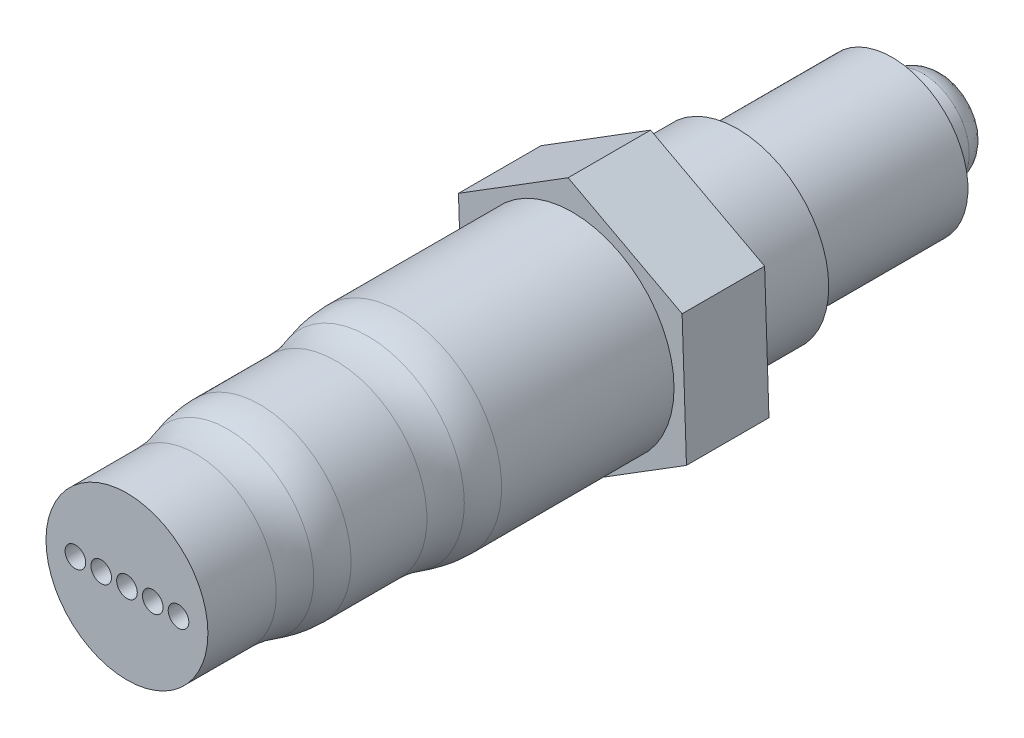
ISO-10303-21;
HEADER;
FILE_DESCRIPTION(('STEP AP214'),'2;1');
FILE_NAME('part.step','',(''),(''),'','','');
FILE_SCHEMA(('AUTOMOTIVE_DESIGN { 1 0 10303 214 1 1 1 1 }'));
ENDSEC;
DATA;
#1=APPLICATION_CONTEXT('core data for automotive mechanical design processes');
#2=APPLICATION_PROTOCOL_DEFINITION('international standard','automotive_design',2000,#1);
#3=PRODUCT_CONTEXT('',#1,'mechanical');
#4=PRODUCT('Part','Part','',(#3));
#5=PRODUCT_RELATED_PRODUCT_CATEGORY('part','',(#4));
#6=PRODUCT_DEFINITION_FORMATION('','',#4);
#7=PRODUCT_DEFINITION_CONTEXT('part definition',#1,'design');
#8=PRODUCT_DEFINITION('design','',#6,#7);
#9=PRODUCT_DEFINITION_SHAPE('','',#8);
#10=(LENGTH_UNIT() NAMED_UNIT(*) SI_UNIT(.MILLI.,.METRE.));
#11=(NAMED_UNIT(*) PLANE_ANGLE_UNIT() SI_UNIT($,.RADIAN.));
#12=(NAMED_UNIT(*) SI_UNIT($,.STERADIAN.) SOLID_ANGLE_UNIT());
#13=UNCERTAINTY_MEASURE_WITH_UNIT(LENGTH_MEASURE(1.E-05),#10,'distance_accuracy_value','');
#14=(GEOMETRIC_REPRESENTATION_CONTEXT(3) GLOBAL_UNCERTAINTY_ASSIGNED_CONTEXT((#13)) GLOBAL_UNIT_ASSIGNED_CONTEXT((#10,
#11,#12)) REPRESENTATION_CONTEXT('',''));
#15=CARTESIAN_POINT('',(0.,0.,0.));
#16=DIRECTION('',(0.,0.,1.));
#17=DIRECTION('',(1.,0.,0.));
#18=AXIS2_PLACEMENT_3D('',#15,#16,#17);
#19=CARTESIAN_POINT('',(0.421341837992579,-12.5214138334651,8.));
#20=DIRECTION('',(-0.528842176408642,0.848720185014691,0.));
#21=DIRECTION('',(-0.848720185014691,-0.528842176408642,0.));
#22=AXIS2_PLACEMENT_3D('',#19,#20,#21);
#23=PLANE('',#22);
#24=DIRECTION('',(0.848720185014691,0.528842176408641,0.));
#25=VECTOR('',#24,1.);
#26=CARTESIAN_POINT('',(0.421341837992579,-12.5214138334651,0.));
#27=LINE('',#26,#25);
#28=CARTESIAN_POINT('',(0.421341837992579,-12.5214138334651,0.));
#29=VERTEX_POINT('',#28);
#30=CARTESIAN_POINT('',(11.0545333900749,-5.89581418135373,0.));
#31=VERTEX_POINT('',#30);
#32=EDGE_CURVE('E142',#29,#31,#27,.T.);
#33=ORIENTED_EDGE('',*,*,#32,.T.);
#34=DIRECTION('',(0.,0.,-1.));
#35=VECTOR('',#34,1.);
#36=CARTESIAN_POINT('',(11.0545333900749,-5.89581418135373,8.));
#37=LINE('',#36,#35);
#38=CARTESIAN_POINT('',(11.0545333900749,-5.89581418135373,8.));
#39=VERTEX_POINT('',#38);
#40=EDGE_CURVE('E170',#39,#31,#37,.T.);
#41=ORIENTED_EDGE('',*,*,#40,.F.);
#42=DIRECTION('',(0.848720185014691,0.528842176408641,0.));
#43=VECTOR('',#42,1.);
#44=CARTESIAN_POINT('',(0.421341837992579,-12.5214138334651,8.));
#45=LINE('',#44,#43);
#46=CARTESIAN_POINT('',(0.421341837992579,-12.5214138334651,8.));
#47=VERTEX_POINT('',#46);
#48=EDGE_CURVE('E159',#47,#39,#45,.T.);
#49=ORIENTED_EDGE('',*,*,#48,.F.);
#50=DIRECTION('',(0.,0.,-1.));
#51=VECTOR('',#50,1.);
#52=CARTESIAN_POINT('',(0.421341837992579,-12.5214138334651,8.));
#53=LINE('',#52,#51);
#54=EDGE_CURVE('E138',#47,#29,#53,.T.);
#55=ORIENTED_EDGE('',*,*,#54,.T.);
#56=EDGE_LOOP('',(#33,#41,#49,#55));
#57=FACE_BOUND('',#56,.T.);
#58=ADVANCED_FACE('F51',(#57),#23,.F.);
#59=CARTESIAN_POINT('',(11.0545333900749,-5.89581418135373,8.));
#60=DIRECTION('',(-0.999434329131672,-0.0336306668551894,0.));
#61=DIRECTION('',(0.0336306668551894,-0.999434329131672,0.));
#62=AXIS2_PLACEMENT_3D('',#59,#60,#61);
#63=PLANE('',#62);
#64=DIRECTION('',(-0.0336306668551894,0.999434329131672,0.));
#65=VECTOR('',#64,1.);
#66=CARTESIAN_POINT('',(11.0545333900749,-5.89581418135373,0.));
#67=LINE('',#66,#65);
#68=CARTESIAN_POINT('',(10.6331915520823,6.62559965211134,0.));
#69=VERTEX_POINT('',#68);
#70=EDGE_CURVE('E146',#31,#69,#67,.T.);
#71=ORIENTED_EDGE('',*,*,#70,.T.);
#72=DIRECTION('',(0.,0.,-1.));
#73=VECTOR('',#72,1.);
#74=CARTESIAN_POINT('',(10.6331915520823,6.62559965211134,8.));
#75=LINE('',#74,#73);
#76=CARTESIAN_POINT('',(10.6331915520823,6.62559965211134,8.));
#77=VERTEX_POINT('',#76);
#78=EDGE_CURVE('E166',#77,#69,#75,.T.);
#79=ORIENTED_EDGE('',*,*,#78,.F.);
#80=DIRECTION('',(-0.0336306668551894,0.999434329131672,0.));
#81=VECTOR('',#80,1.);
#82=CARTESIAN_POINT('',(11.0545333900749,-5.89581418135373,8.));
#83=LINE('',#82,#81);
#84=EDGE_CURVE('E107',#39,#77,#83,.T.);
#85=ORIENTED_EDGE('',*,*,#84,.F.);
#86=ORIENTED_EDGE('',*,*,#40,.T.);
#87=EDGE_LOOP('',(#71,#79,#85,#86));
#88=FACE_BOUND('',#87,.T.);
#89=ADVANCED_FACE('F212',(#88),#63,.F.);
#90=CARTESIAN_POINT('',(10.6331915520823,6.62559965211134,8.));
#91=DIRECTION('',(-0.470592152723031,-0.88235085186988,0.));
#92=DIRECTION('',(0.88235085186988,-0.470592152723031,0.));
#93=AXIS2_PLACEMENT_3D('',#90,#91,#92);
#94=PLANE('',#93);
#95=DIRECTION('',(-0.88235085186988,0.470592152723031,0.));
#96=VECTOR('',#95,1.);
#97=CARTESIAN_POINT('',(10.6331915520823,6.62559965211134,0.));
#98=LINE('',#97,#96);
#99=CARTESIAN_POINT('',(-0.42134183799258,12.5214138334651,0.));
#100=VERTEX_POINT('',#99);
#101=EDGE_CURVE('E150',#69,#100,#98,.T.);
#102=ORIENTED_EDGE('',*,*,#101,.T.);
#103=DIRECTION('',(0.,0.,-1.));
#104=VECTOR('',#103,1.);
#105=CARTESIAN_POINT('',(-0.42134183799258,12.5214138334651,8.));
#106=LINE('',#105,#104);
#107=CARTESIAN_POINT('',(-0.42134183799258,12.5214138334651,8.));
#108=VERTEX_POINT('',#107);
#109=EDGE_CURVE('E131',#108,#100,#106,.T.);
#110=ORIENTED_EDGE('',*,*,#109,.F.);
#111=DIRECTION('',(-0.88235085186988,0.470592152723031,0.));
#112=VECTOR('',#111,1.);
#113=CARTESIAN_POINT('',(10.6331915520823,6.62559965211134,8.));
#114=LINE('',#113,#112);
#115=EDGE_CURVE('E120',#77,#108,#114,.T.);
#116=ORIENTED_EDGE('',*,*,#115,.F.);
#117=ORIENTED_EDGE('',*,*,#78,.T.);
#118=EDGE_LOOP('',(#102,#110,#116,#117));
#119=FACE_BOUND('',#118,.T.);
#120=ADVANCED_FACE('F218',(#119),#94,.F.);
#121=CARTESIAN_POINT('',(-0.42134183799258,12.5214138334651,8.));
#122=DIRECTION('',(0.528842176408641,-0.848720185014691,0.));
#123=DIRECTION('',(0.848720185014691,0.528842176408641,0.));
#124=AXIS2_PLACEMENT_3D('',#121,#122,#123);
#125=PLANE('',#124);
#126=DIRECTION('',(-0.848720185014691,-0.528842176408641,0.));
#127=VECTOR('',#126,1.);
#128=CARTESIAN_POINT('',(-0.42134183799258,12.5214138334651,0.));
#129=LINE('',#128,#127);
#130=CARTESIAN_POINT('',(-11.0545333900749,5.89581418135374,0.));
#131=VERTEX_POINT('',#130);
#132=EDGE_CURVE('E129',#100,#131,#129,.T.);
#133=ORIENTED_EDGE('',*,*,#132,.T.);
#134=DIRECTION('',(0.,0.,-1.));
#135=VECTOR('',#134,1.);
#136=CARTESIAN_POINT('',(-11.0545333900749,5.89581418135374,8.));
#137=LINE('',#136,#135);
#138=CARTESIAN_POINT('',(-11.0545333900749,5.89581418135374,8.));
#139=VERTEX_POINT('',#138);
#140=EDGE_CURVE('E126',#139,#131,#137,.T.);
#141=ORIENTED_EDGE('',*,*,#140,.F.);
#142=DIRECTION('',(-0.848720185014691,-0.528842176408641,0.));
#143=VECTOR('',#142,1.);
#144=CARTESIAN_POINT('',(-0.42134183799258,12.5214138334651,8.));
#145=LINE('',#144,#143);
#146=EDGE_CURVE('E114',#108,#139,#145,.T.);
#147=ORIENTED_EDGE('',*,*,#146,.F.);
#148=ORIENTED_EDGE('',*,*,#109,.T.);
#149=EDGE_LOOP('',(#133,#141,#147,#148));
#150=FACE_BOUND('',#149,.T.);
#151=ADVANCED_FACE('F127',(#150),#125,.F.);
#152=CARTESIAN_POINT('',(-11.0545333900749,5.89581418135374,8.));
#153=DIRECTION('',(0.999434329131672,0.0336306668551891,0.));
#154=DIRECTION('',(-0.0336306668551891,0.999434329131672,0.));
#155=AXIS2_PLACEMENT_3D('',#152,#153,#154);
#156=PLANE('',#155);
#157=DIRECTION('',(0.0336306668551891,-0.999434329131672,0.));
#158=VECTOR('',#157,1.);
#159=CARTESIAN_POINT('',(-11.0545333900749,5.89581418135374,0.));
#160=LINE('',#159,#158);
#161=CARTESIAN_POINT('',(-10.6331915520824,-6.62559965211133,0.));
#162=VERTEX_POINT('',#161);
#163=EDGE_CURVE('E92',#131,#162,#160,.T.);
#164=ORIENTED_EDGE('',*,*,#163,.T.);
#165=DIRECTION('',(0.,0.,-1.));
#166=VECTOR('',#165,1.);
#167=CARTESIAN_POINT('',(-10.6331915520824,-6.62559965211133,8.));
#168=LINE('',#167,#166);
#169=CARTESIAN_POINT('',(-10.6331915520824,-6.62559965211133,8.));
#170=VERTEX_POINT('',#169);
#171=EDGE_CURVE('E132',#170,#162,#168,.T.);
#172=ORIENTED_EDGE('',*,*,#171,.F.);
#173=DIRECTION('',(0.0336306668551891,-0.999434329131672,0.));
#174=VECTOR('',#173,1.);
#175=CARTESIAN_POINT('',(-11.0545333900749,5.89581418135374,8.));
#176=LINE('',#175,#174);
#177=EDGE_CURVE('E118',#139,#170,#176,.T.);
#178=ORIENTED_EDGE('',*,*,#177,.F.);
#179=ORIENTED_EDGE('',*,*,#140,.T.);
#180=EDGE_LOOP('',(#164,#172,#178,#179));
#181=FACE_BOUND('',#180,.T.);
#182=ADVANCED_FACE('F134',(#181),#156,.F.);
#183=CARTESIAN_POINT('',(-10.6331915520824,-6.62559965211133,8.));
#184=DIRECTION('',(0.470592152723031,0.88235085186988,0.));
#185=DIRECTION('',(-0.88235085186988,0.470592152723031,0.));
#186=AXIS2_PLACEMENT_3D('',#183,#184,#185);
#187=PLANE('',#186);
#188=DIRECTION('',(0.88235085186988,-0.470592152723031,0.));
#189=VECTOR('',#188,1.);
#190=CARTESIAN_POINT('',(-10.6331915520824,-6.62559965211133,0.));
#191=LINE('',#190,#189);
#192=EDGE_CURVE('E98',#162,#29,#191,.T.);
#193=ORIENTED_EDGE('',*,*,#192,.T.);
#194=ORIENTED_EDGE('',*,*,#54,.F.);
#195=DIRECTION('',(0.88235085186988,-0.470592152723031,0.));
#196=VECTOR('',#195,1.);
#197=CARTESIAN_POINT('',(-10.6331915520824,-6.62559965211133,8.));
#198=LINE('',#197,#196);
#199=EDGE_CURVE('E69',#170,#47,#198,.T.);
#200=ORIENTED_EDGE('',*,*,#199,.F.);
#201=ORIENTED_EDGE('',*,*,#171,.T.);
#202=EDGE_LOOP('',(#193,#194,#200,#201));
#203=FACE_BOUND('',#202,.T.);
#204=ADVANCED_FACE('F257',(#203),#187,.F.);
#205=CARTESIAN_POINT('',(0.,0.,8.));
#206=DIRECTION('',(0.,0.,1.));
#207=DIRECTION('',(1.,0.,0.));
#208=AXIS2_PLACEMENT_3D('',#205,#206,#207);
#209=PLANE('',#208);
#210=CARTESIAN_POINT('',(0.,0.,8.));
#211=DIRECTION('',(0.,0.,1.));
#212=DIRECTION('',(1.,0.,0.));
#213=AXIS2_PLACEMENT_3D('',#210,#211,#212);
#214=CIRCLE('',#213,9.85);
#215=CARTESIAN_POINT('',(9.85,0.,8.));
#216=VERTEX_POINT('',#215);
#217=EDGE_CURVE('E147',#216,#216,#214,.T.);
#218=ORIENTED_EDGE('',*,*,#217,.F.);
#219=EDGE_LOOP('',(#218));
#220=FACE_BOUND('',#219,.T.);
#221=ORIENTED_EDGE('',*,*,#48,.T.);
#222=ORIENTED_EDGE('',*,*,#84,.T.);
#223=ORIENTED_EDGE('',*,*,#115,.T.);
#224=ORIENTED_EDGE('',*,*,#146,.T.);
#225=ORIENTED_EDGE('',*,*,#177,.T.);
#226=ORIENTED_EDGE('',*,*,#199,.T.);
#227=EDGE_LOOP('',(#221,#222,#223,#224,#225,#226));
#228=FACE_BOUND('',#227,.T.);
#229=ADVANCED_FACE('F116',(#220,#228),#209,.T.);
#230=CARTESIAN_POINT('',(0.,0.,0.));
#231=DIRECTION('',(0.,0.,1.));
#232=DIRECTION('',(1.,0.,0.));
#233=AXIS2_PLACEMENT_3D('',#230,#231,#232);
#234=PLANE('',#233);
#235=CARTESIAN_POINT('',(0.,0.,0.));
#236=DIRECTION('',(0.,0.,1.));
#237=DIRECTION('',(1.,0.,0.));
#238=AXIS2_PLACEMENT_3D('',#235,#236,#237);
#239=CIRCLE('',#238,8.85);
#240=CARTESIAN_POINT('',(8.85,0.,0.));
#241=VERTEX_POINT('',#240);
#242=EDGE_CURVE('E173',#241,#241,#239,.F.);
#243=ORIENTED_EDGE('',*,*,#242,.F.);
#244=EDGE_LOOP('',(#243));
#245=FACE_BOUND('',#244,.T.);
#246=ORIENTED_EDGE('',*,*,#32,.F.);
#247=ORIENTED_EDGE('',*,*,#192,.F.);
#248=ORIENTED_EDGE('',*,*,#163,.F.);
#249=ORIENTED_EDGE('',*,*,#132,.F.);
#250=ORIENTED_EDGE('',*,*,#101,.F.);
#251=ORIENTED_EDGE('',*,*,#70,.F.);
#252=EDGE_LOOP('',(#246,#247,#248,#249,#250,#251));
#253=FACE_BOUND('',#252,.T.);
#254=ADVANCED_FACE('F250',(#245,#253),#234,.F.);
#255=CARTESIAN_POINT('',(0.,0.,26.6));
#256=DIRECTION('',(0.,0.,-1.));
#257=DIRECTION('',(-1.,0.,0.));
#258=AXIS2_PLACEMENT_3D('',#255,#256,#257);
#259=CYLINDRICAL_SURFACE('',#258,9.85);
#260=CARTESIAN_POINT('',(0.,0.,24.7139009451423));
#261=DIRECTION('',(0.,0.,-1.));
#262=DIRECTION('',(-1.,0.,0.));
#263=AXIS2_PLACEMENT_3D('',#260,#261,#262);
#264=CIRCLE('',#263,9.85);
#265=CARTESIAN_POINT('',(-9.85,0.,24.7139009451423));
#266=VERTEX_POINT('',#265);
#267=EDGE_CURVE('E185',#266,#266,#264,.T.);
#268=ORIENTED_EDGE('',*,*,#267,.T.);
#269=EDGE_LOOP('',(#268));
#270=FACE_BOUND('',#269,.T.);
#271=ORIENTED_EDGE('',*,*,#217,.T.);
#272=EDGE_LOOP('',(#271));
#273=FACE_BOUND('',#272,.T.);
#274=ADVANCED_FACE('F240',(#270,#273),#259,.T.);
#275=CARTESIAN_POINT('',(0.,0.,40.2));
#276=DIRECTION('',(0.,0.,-1.));
#277=DIRECTION('',(-1.,0.,0.));
#278=AXIS2_PLACEMENT_3D('',#275,#276,#277);
#279=CYLINDRICAL_SURFACE('',#278,8.85);
#280=CARTESIAN_POINT('',(0.,0.,38.3139009451423));
#281=DIRECTION('',(0.,0.,-1.));
#282=DIRECTION('',(-1.,0.,0.));
#283=AXIS2_PLACEMENT_3D('',#280,#281,#282);
#284=CIRCLE('',#283,8.85);
#285=CARTESIAN_POINT('',(-8.85,0.,38.3139009451423));
#286=VERTEX_POINT('',#285);
#287=EDGE_CURVE('E13',#286,#286,#284,.T.);
#288=ORIENTED_EDGE('',*,*,#287,.T.);
#289=EDGE_LOOP('',(#288));
#290=FACE_BOUND('',#289,.T.);
#291=CARTESIAN_POINT('',(0.,0.,30.9588989435407));
#292=DIRECTION('',(0.,0.,-1.));
#293=DIRECTION('',(-1.,0.,0.));
#294=AXIS2_PLACEMENT_3D('',#291,#292,#293);
#295=CIRCLE('',#294,8.85);
#296=CARTESIAN_POINT('',(-8.85,0.,30.9588989435407));
#297=VERTEX_POINT('',#296);
#298=EDGE_CURVE('E177',#297,#297,#295,.F.);
#299=ORIENTED_EDGE('',*,*,#298,.T.);
#300=EDGE_LOOP('',(#299));
#301=FACE_BOUND('',#300,.T.);
#302=ADVANCED_FACE('F237',(#290,#301),#279,.T.);
#303=CARTESIAN_POINT('',(0.,0.,51.2));
#304=DIRECTION('',(0.,0.,-1.));
#305=DIRECTION('',(-1.,0.,0.));
#306=AXIS2_PLACEMENT_3D('',#303,#304,#305);
#307=CYLINDRICAL_SURFACE('',#306,7.85);
#308=CARTESIAN_POINT('',(0.,0.,44.5588989435407));
#309=DIRECTION('',(0.,0.,-1.));
#310=DIRECTION('',(-1.,0.,0.));
#311=AXIS2_PLACEMENT_3D('',#308,#309,#310);
#312=CIRCLE('',#311,7.85);
#313=CARTESIAN_POINT('',(-7.85,0.,44.5588989435407));
#314=VERTEX_POINT('',#313);
#315=EDGE_CURVE('E189',#314,#314,#312,.F.);
#316=ORIENTED_EDGE('',*,*,#315,.T.);
#317=EDGE_LOOP('',(#316));
#318=FACE_BOUND('',#317,.T.);
#319=CARTESIAN_POINT('',(0.,0.,51.2));
#320=DIRECTION('',(0.,0.,1.));
#321=DIRECTION('',(1.,0.,0.));
#322=AXIS2_PLACEMENT_3D('',#319,#320,#321);
#323=CIRCLE('',#322,7.85);
#324=CARTESIAN_POINT('',(7.85,0.,51.2));
#325=VERTEX_POINT('',#324);
#326=EDGE_CURVE('E285',#325,#325,#323,.T.);
#327=ORIENTED_EDGE('',*,*,#326,.F.);
#328=EDGE_LOOP('',(#327));
#329=FACE_BOUND('',#328,.T.);
#330=ADVANCED_FACE('F239',(#318,#329),#307,.T.);
#331=CARTESIAN_POINT('',(0.,0.,51.2));
#332=DIRECTION('',(0.,0.,1.));
#333=DIRECTION('',(1.,0.,0.));
#334=AXIS2_PLACEMENT_3D('',#331,#332,#333);
#335=PLANE('',#334);
#336=CARTESIAN_POINT('',(-2.5,0.,51.2));
#337=DIRECTION('',(0.,0.,1.));
#338=DIRECTION('',(-1.,0.,0.));
#339=AXIS2_PLACEMENT_3D('',#336,#337,#338);
#340=CIRCLE('',#339,1.);
#341=CARTESIAN_POINT('',(-3.5,0.,51.2));
#342=VERTEX_POINT('',#341);
#343=EDGE_CURVE('E357',#342,#342,#340,.T.);
#344=ORIENTED_EDGE('',*,*,#343,.F.);
#345=EDGE_LOOP('',(#344));
#346=FACE_BOUND('',#345,.T.);
#347=CARTESIAN_POINT('',(-5.,0.,51.2));
#348=DIRECTION('',(0.,0.,1.));
#349=DIRECTION('',(-1.,0.,0.));
#350=AXIS2_PLACEMENT_3D('',#347,#348,#349);
#351=CIRCLE('',#350,1.);
#352=CARTESIAN_POINT('',(-6.,0.,51.2));
#353=VERTEX_POINT('',#352);
#354=EDGE_CURVE('E361',#353,#353,#351,.T.);
#355=ORIENTED_EDGE('',*,*,#354,.F.);
#356=EDGE_LOOP('',(#355));
#357=FACE_BOUND('',#356,.T.);
#358=CARTESIAN_POINT('',(5.,0.,51.2));
#359=DIRECTION('',(0.,0.,1.));
#360=DIRECTION('',(1.,0.,0.));
#361=AXIS2_PLACEMENT_3D('',#358,#359,#360);
#362=CIRCLE('',#361,1.);
#363=CARTESIAN_POINT('',(6.,0.,51.2));
#364=VERTEX_POINT('',#363);
#365=EDGE_CURVE('E365',#364,#364,#362,.T.);
#366=ORIENTED_EDGE('',*,*,#365,.F.);
#367=EDGE_LOOP('',(#366));
#368=FACE_BOUND('',#367,.T.);
#369=CARTESIAN_POINT('',(2.5,0.,51.2));
#370=DIRECTION('',(0.,0.,1.));
#371=DIRECTION('',(1.,0.,0.));
#372=AXIS2_PLACEMENT_3D('',#369,#370,#371);
#373=CIRCLE('',#372,1.);
#374=CARTESIAN_POINT('',(3.5,0.,51.2));
#375=VERTEX_POINT('',#374);
#376=EDGE_CURVE('E369',#375,#375,#373,.T.);
#377=ORIENTED_EDGE('',*,*,#376,.F.);
#378=EDGE_LOOP('',(#377));
#379=FACE_BOUND('',#378,.T.);
#380=CARTESIAN_POINT('',(0.,0.,51.2));
#381=DIRECTION('',(0.,0.,1.));
#382=DIRECTION('',(1.,0.,0.));
#383=AXIS2_PLACEMENT_3D('',#380,#381,#382);
#384=CIRCLE('',#383,1.);
#385=CARTESIAN_POINT('',(1.,0.,51.2));
#386=VERTEX_POINT('',#385);
#387=EDGE_CURVE('E318',#386,#386,#384,.T.);
#388=ORIENTED_EDGE('',*,*,#387,.F.);
#389=EDGE_LOOP('',(#388));
#390=FACE_BOUND('',#389,.T.);
#391=ORIENTED_EDGE('',*,*,#326,.T.);
#392=EDGE_LOOP('',(#391));
#393=FACE_BOUND('',#392,.T.);
#394=ADVANCED_FACE('F247',(#346,#357,#368,#379,#390,#393),#335,.T.);
#395=CARTESIAN_POINT('',(0.,0.,-8.));
#396=DIRECTION('',(0.,0.,1.));
#397=DIRECTION('',(1.,0.,0.));
#398=AXIS2_PLACEMENT_3D('',#395,#396,#397);
#399=CYLINDRICAL_SURFACE('',#398,8.85);
#400=CARTESIAN_POINT('',(0.,0.,-8.));
#401=DIRECTION('',(0.,0.,-1.));
#402=DIRECTION('',(-1.,0.,0.));
#403=AXIS2_PLACEMENT_3D('',#400,#401,#402);
#404=CIRCLE('',#403,8.85);
#405=CARTESIAN_POINT('',(-8.85,0.,-8.));
#406=VERTEX_POINT('',#405);
#407=EDGE_CURVE('E289',#406,#406,#404,.T.);
#408=ORIENTED_EDGE('',*,*,#407,.F.);
#409=EDGE_LOOP('',(#408));
#410=FACE_BOUND('',#409,.T.);
#411=ORIENTED_EDGE('',*,*,#242,.T.);
#412=EDGE_LOOP('',(#411));
#413=FACE_BOUND('',#412,.T.);
#414=ADVANCED_FACE('F344',(#410,#413),#399,.T.);
#415=CARTESIAN_POINT('',(0.,0.,-8.));
#416=DIRECTION('',(0.,0.,-1.));
#417=DIRECTION('',(-1.,0.,0.));
#418=AXIS2_PLACEMENT_3D('',#415,#416,#417);
#419=PLANE('',#418);
#420=CARTESIAN_POINT('',(0.,0.,-8.));
#421=DIRECTION('',(0.,0.,-1.));
#422=DIRECTION('',(-1.,0.,0.));
#423=AXIS2_PLACEMENT_3D('',#420,#421,#422);
#424=CIRCLE('',#423,7.35);
#425=CARTESIAN_POINT('',(-7.35,0.,-8.));
#426=VERTEX_POINT('',#425);
#427=EDGE_CURVE('E294',#426,#426,#424,.T.);
#428=ORIENTED_EDGE('',*,*,#427,.F.);
#429=EDGE_LOOP('',(#428));
#430=FACE_BOUND('',#429,.T.);
#431=ORIENTED_EDGE('',*,*,#407,.T.);
#432=EDGE_LOOP('',(#431));
#433=FACE_BOUND('',#432,.T.);
#434=ADVANCED_FACE('F340',(#430,#433),#419,.T.);
#435=CARTESIAN_POINT('',(0.,0.,-23.));
#436=DIRECTION('',(0.,0.,1.));
#437=DIRECTION('',(1.,0.,0.));
#438=AXIS2_PLACEMENT_3D('',#435,#436,#437);
#439=CYLINDRICAL_SURFACE('',#438,7.35);
#440=CARTESIAN_POINT('',(0.,0.,-23.));
#441=DIRECTION('',(0.,0.,-1.));
#442=DIRECTION('',(-1.,0.,0.));
#443=AXIS2_PLACEMENT_3D('',#440,#441,#442);
#444=CIRCLE('',#443,7.35);
#445=CARTESIAN_POINT('',(-7.35,0.,-23.));
#446=VERTEX_POINT('',#445);
#447=EDGE_CURVE('E293',#446,#446,#444,.T.);
#448=ORIENTED_EDGE('',*,*,#447,.F.);
#449=EDGE_LOOP('',(#448));
#450=FACE_BOUND('',#449,.T.);
#451=ORIENTED_EDGE('',*,*,#427,.T.);
#452=EDGE_LOOP('',(#451));
#453=FACE_BOUND('',#452,.T.);
#454=ADVANCED_FACE('F336',(#450,#453),#439,.T.);
#455=CARTESIAN_POINT('',(0.,0.,-23.));
#456=DIRECTION('',(0.,0.,-1.));
#457=DIRECTION('',(-1.,0.,0.));
#458=AXIS2_PLACEMENT_3D('',#455,#456,#457);
#459=PLANE('',#458);
#460=CARTESIAN_POINT('',(0.,0.,-23.));
#461=DIRECTION('',(0.,0.,-1.));
#462=DIRECTION('',(-1.,0.,0.));
#463=AXIS2_PLACEMENT_3D('',#460,#461,#462);
#464=CIRCLE('',#463,4.5);
#465=CARTESIAN_POINT('',(-4.5,0.,-23.));
#466=VERTEX_POINT('',#465);
#467=EDGE_CURVE('E298',#466,#466,#464,.T.);
#468=ORIENTED_EDGE('',*,*,#467,.F.);
#469=EDGE_LOOP('',(#468));
#470=FACE_BOUND('',#469,.T.);
#471=ORIENTED_EDGE('',*,*,#447,.T.);
#472=EDGE_LOOP('',(#471));
#473=FACE_BOUND('',#472,.T.);
#474=ADVANCED_FACE('F332',(#470,#473),#459,.T.);
#475=CARTESIAN_POINT('',(0.,0.,-28.));
#476=DIRECTION('',(0.,0.,1.));
#477=DIRECTION('',(1.,0.,0.));
#478=AXIS2_PLACEMENT_3D('',#475,#476,#477);
#479=CYLINDRICAL_SURFACE('',#478,4.5);
#480=CARTESIAN_POINT('',(0.,0.,-25.9790174373991));
#481=DIRECTION('',(0.,0.,-1.));
#482=DIRECTION('',(-1.,0.,0.));
#483=AXIS2_PLACEMENT_3D('',#480,#481,#482);
#484=CIRCLE('',#483,4.5);
#485=CARTESIAN_POINT('',(-4.5,0.,-25.9790174373991));
#486=VERTEX_POINT('',#485);
#487=EDGE_CURVE('E309',#486,#486,#484,.T.);
#488=ORIENTED_EDGE('',*,*,#487,.F.);
#489=EDGE_LOOP('',(#488));
#490=FACE_BOUND('',#489,.T.);
#491=ORIENTED_EDGE('',*,*,#467,.T.);
#492=EDGE_LOOP('',(#491));
#493=FACE_BOUND('',#492,.T.);
#494=ADVANCED_FACE('F225',(#490,#493),#479,.T.);
#495=CARTESIAN_POINT('',(0.,0.,30.9588989435407));
#496=DIRECTION('',(0.,0.,-1.));
#497=DIRECTION('',(-1.,0.,0.));
#498=AXIS2_PLACEMENT_3D('',#495,#496,#497);
#499=TOROIDAL_SURFACE('',#498,18.85,10.);
#500=CARTESIAN_POINT('',(0.,0.,27.8363999443415));
#501=DIRECTION('',(0.,0.,1.));
#502=DIRECTION('',(1.,0.,0.));
#503=AXIS2_PLACEMENT_3D('',#500,#501,#502);
#504=CIRCLE('',#503,9.35);
#505=CARTESIAN_POINT('',(9.35,0.,27.8363999443415));
#506=VERTEX_POINT('',#505);
#507=EDGE_CURVE('E181',#506,#506,#504,.T.);
#508=ORIENTED_EDGE('',*,*,#507,.T.);
#509=EDGE_LOOP('',(#508));
#510=FACE_BOUND('',#509,.T.);
#511=ORIENTED_EDGE('',*,*,#298,.F.);
#512=EDGE_LOOP('',(#511));
#513=FACE_BOUND('',#512,.T.);
#514=ADVANCED_FACE('F222',(#510,#513),#499,.F.);
#515=CARTESIAN_POINT('',(0.,0.,24.7139009451423));
#516=DIRECTION('',(0.,0.,-1.));
#517=DIRECTION('',(-1.,0.,0.));
#518=AXIS2_PLACEMENT_3D('',#515,#516,#517);
#519=DEGENERATE_TOROIDAL_SURFACE('',#518,0.15,10.,.F.);
#520=ORIENTED_EDGE('',*,*,#267,.F.);
#521=EDGE_LOOP('',(#520));
#522=FACE_BOUND('',#521,.T.);
#523=ORIENTED_EDGE('',*,*,#507,.F.);
#524=EDGE_LOOP('',(#523));
#525=FACE_BOUND('',#524,.T.);
#526=ADVANCED_FACE('F209',(#522,#525),#519,.F.);
#527=CARTESIAN_POINT('',(0.,0.,44.5588989435407));
#528=DIRECTION('',(0.,0.,-1.));
#529=DIRECTION('',(-1.,0.,0.));
#530=AXIS2_PLACEMENT_3D('',#527,#528,#529);
#531=TOROIDAL_SURFACE('',#530,17.85,10.);
#532=CARTESIAN_POINT('',(0.,0.,41.4363999443415));
#533=DIRECTION('',(0.,0.,1.));
#534=DIRECTION('',(1.,0.,0.));
#535=AXIS2_PLACEMENT_3D('',#532,#533,#534);
#536=CIRCLE('',#535,8.35);
#537=CARTESIAN_POINT('',(8.35,0.,41.4363999443415));
#538=VERTEX_POINT('',#537);
#539=EDGE_CURVE('E61',#538,#538,#536,.T.);
#540=ORIENTED_EDGE('',*,*,#539,.T.);
#541=EDGE_LOOP('',(#540));
#542=FACE_BOUND('',#541,.T.);
#543=ORIENTED_EDGE('',*,*,#315,.F.);
#544=EDGE_LOOP('',(#543));
#545=FACE_BOUND('',#544,.T.);
#546=ADVANCED_FACE('F196',(#542,#545),#531,.F.);
#547=CARTESIAN_POINT('',(0.,0.,38.3139009451423));
#548=DIRECTION('',(0.,0.,-1.));
#549=DIRECTION('',(-1.,0.,0.));
#550=AXIS2_PLACEMENT_3D('',#547,#548,#549);
#551=DEGENERATE_TOROIDAL_SURFACE('',#550,1.15,10.,.F.);
#552=ORIENTED_EDGE('',*,*,#287,.F.);
#553=EDGE_LOOP('',(#552));
#554=FACE_BOUND('',#553,.T.);
#555=ORIENTED_EDGE('',*,*,#539,.F.);
#556=EDGE_LOOP('',(#555));
#557=FACE_BOUND('',#556,.T.);
#558=ADVANCED_FACE('F53',(#554,#557),#551,.F.);
#559=CARTESIAN_POINT('',(0.,4.5,-25.9790174373991));
#560=CARTESIAN_POINT('',(0.,4.37830725162518,-26.8241775672877));
#561=CARTESIAN_POINT('',(0.,3.92794716632549,-27.7719627054962));
#562=CARTESIAN_POINT('',(0.,3.01241221521023,-28.));
#563=B_SPLINE_CURVE_WITH_KNOTS('',3,(#559,#560,#561,#562),.UNSPECIFIED.,.F.,.F.,(4,4),(0.,1.),.UNSPECIFIED.);
#564=CARTESIAN_POINT('',(0.,0.,-28.));
#565=DIRECTION('',(0.,0.,-1.));
#566=AXIS1_PLACEMENT('',#564,#565);
#567=SURFACE_OF_REVOLUTION('',#563,#566);
#568=CARTESIAN_POINT('',(0.,0.,-28.));
#569=DIRECTION('',(0.,0.,-1.));
#570=DIRECTION('',(-1.,0.,0.));
#571=AXIS2_PLACEMENT_3D('',#568,#569,#570);
#572=CIRCLE('',#571,3.01241221521023);
#573=CARTESIAN_POINT('',(-3.01241221521023,0.,-28.));
#574=VERTEX_POINT('',#573);
#575=EDGE_CURVE('E305',#574,#574,#572,.T.);
#576=ORIENTED_EDGE('',*,*,#575,.F.);
#577=EDGE_LOOP('',(#576));
#578=FACE_BOUND('',#577,.T.);
#579=ORIENTED_EDGE('',*,*,#487,.T.);
#580=EDGE_LOOP('',(#579));
#581=FACE_BOUND('',#580,.T.);
#582=ADVANCED_FACE('F200',(#578,#581),#567,.T.);
#583=CARTESIAN_POINT('',(0.,0.,-28.));
#584=DIRECTION('',(0.,0.,-1.));
#585=DIRECTION('',(-1.,0.,0.));
#586=AXIS2_PLACEMENT_3D('',#583,#584,#585);
#587=PLANE('',#586);
#588=ORIENTED_EDGE('',*,*,#575,.T.);
#589=EDGE_LOOP('',(#588));
#590=FACE_BOUND('',#589,.T.);
#591=ADVANCED_FACE('F206',(#590),#587,.T.);
#592=CARTESIAN_POINT('',(0.,0.,49.2));
#593=DIRECTION('',(0.,0.,1.));
#594=DIRECTION('',(1.,0.,0.));
#595=AXIS2_PLACEMENT_3D('',#592,#593,#594);
#596=CYLINDRICAL_SURFACE('',#595,1.);
#597=CARTESIAN_POINT('',(0.,0.,49.2));
#598=DIRECTION('',(0.,0.,1.));
#599=DIRECTION('',(1.,0.,0.));
#600=AXIS2_PLACEMENT_3D('',#597,#598,#599);
#601=CIRCLE('',#600,1.);
#602=CARTESIAN_POINT('',(1.,0.,49.2));
#603=VERTEX_POINT('',#602);
#604=EDGE_CURVE('E313',#603,#603,#601,.T.);
#605=ORIENTED_EDGE('',*,*,#604,.F.);
#606=EDGE_LOOP('',(#605));
#607=FACE_BOUND('',#606,.T.);
#608=ORIENTED_EDGE('',*,*,#387,.T.);
#609=EDGE_LOOP('',(#608));
#610=FACE_BOUND('',#609,.T.);
#611=ADVANCED_FACE('F325',(#607,#610),#596,.F.);
#612=CARTESIAN_POINT('',(0.,0.,49.2));
#613=DIRECTION('',(0.,0.,1.));
#614=DIRECTION('',(1.,0.,0.));
#615=AXIS2_PLACEMENT_3D('',#612,#613,#614);
#616=PLANE('',#615);
#617=ORIENTED_EDGE('',*,*,#604,.T.);
#618=EDGE_LOOP('',(#617));
#619=FACE_BOUND('',#618,.T.);
#620=ADVANCED_FACE('F423',(#619),#616,.T.);
#621=CARTESIAN_POINT('',(2.5,0.,49.2));
#622=DIRECTION('',(0.,0.,1.));
#623=DIRECTION('',(1.,0.,0.));
#624=AXIS2_PLACEMENT_3D('',#621,#622,#623);
#625=CYLINDRICAL_SURFACE('',#624,1.);
#626=CARTESIAN_POINT('',(2.5,0.,49.2));
#627=DIRECTION('',(0.,0.,1.));
#628=DIRECTION('',(1.,0.,0.));
#629=AXIS2_PLACEMENT_3D('',#626,#627,#628);
#630=CIRCLE('',#629,1.);
#631=CARTESIAN_POINT('',(3.5,0.,49.2));
#632=VERTEX_POINT('',#631);
#633=EDGE_CURVE('E377',#632,#632,#630,.T.);
#634=ORIENTED_EDGE('',*,*,#633,.F.);
#635=EDGE_LOOP('',(#634));
#636=FACE_BOUND('',#635,.T.);
#637=ORIENTED_EDGE('',*,*,#376,.T.);
#638=EDGE_LOOP('',(#637));
#639=FACE_BOUND('',#638,.T.);
#640=ADVANCED_FACE('F425',(#636,#639),#625,.F.);
#641=CARTESIAN_POINT('',(2.5,0.,49.2));
#642=DIRECTION('',(0.,0.,1.));
#643=DIRECTION('',(1.,0.,0.));
#644=AXIS2_PLACEMENT_3D('',#641,#642,#643);
#645=PLANE('',#644);
#646=ORIENTED_EDGE('',*,*,#633,.T.);
#647=EDGE_LOOP('',(#646));
#648=FACE_BOUND('',#647,.T.);
#649=ADVANCED_FACE('F431',(#648),#645,.T.);
#650=CARTESIAN_POINT('',(5.,0.,49.2));
#651=DIRECTION('',(0.,0.,1.));
#652=DIRECTION('',(1.,0.,0.));
#653=AXIS2_PLACEMENT_3D('',#650,#651,#652);
#654=CYLINDRICAL_SURFACE('',#653,1.);
#655=CARTESIAN_POINT('',(5.,0.,49.2));
#656=DIRECTION('',(0.,0.,1.));
#657=DIRECTION('',(1.,0.,0.));
#658=AXIS2_PLACEMENT_3D('',#655,#656,#657);
#659=CIRCLE('',#658,1.);
#660=CARTESIAN_POINT('',(6.,0.,49.2));
#661=VERTEX_POINT('',#660);
#662=EDGE_CURVE('E386',#661,#661,#659,.T.);
#663=ORIENTED_EDGE('',*,*,#662,.F.);
#664=EDGE_LOOP('',(#663));
#665=FACE_BOUND('',#664,.T.);
#666=ORIENTED_EDGE('',*,*,#365,.T.);
#667=EDGE_LOOP('',(#666));
#668=FACE_BOUND('',#667,.T.);
#669=ADVANCED_FACE('F581',(#665,#668),#654,.F.);
#670=CARTESIAN_POINT('',(5.,0.,49.2));
#671=DIRECTION('',(0.,0.,1.));
#672=DIRECTION('',(1.,0.,0.));
#673=AXIS2_PLACEMENT_3D('',#670,#671,#672);
#674=PLANE('',#673);
#675=ORIENTED_EDGE('',*,*,#662,.T.);
#676=EDGE_LOOP('',(#675));
#677=FACE_BOUND('',#676,.T.);
#678=ADVANCED_FACE('F589',(#677),#674,.T.);
#679=CARTESIAN_POINT('',(-5.,0.,49.2));
#680=DIRECTION('',(0.,0.,1.));
#681=DIRECTION('',(1.,0.,0.));
#682=AXIS2_PLACEMENT_3D('',#679,#680,#681);
#683=CYLINDRICAL_SURFACE('',#682,1.);
#684=CARTESIAN_POINT('',(-5.,0.,49.2));
#685=DIRECTION('',(0.,0.,1.));
#686=DIRECTION('',(-1.,0.,0.));
#687=AXIS2_PLACEMENT_3D('',#684,#685,#686);
#688=CIRCLE('',#687,1.);
#689=CARTESIAN_POINT('',(-6.,0.,49.2));
#690=VERTEX_POINT('',#689);
#691=EDGE_CURVE('E394',#690,#690,#688,.T.);
#692=ORIENTED_EDGE('',*,*,#691,.F.);
#693=EDGE_LOOP('',(#692));
#694=FACE_BOUND('',#693,.T.);
#695=ORIENTED_EDGE('',*,*,#354,.T.);
#696=EDGE_LOOP('',(#695));
#697=FACE_BOUND('',#696,.T.);
#698=ADVANCED_FACE('F418',(#694,#697),#683,.F.);
#699=CARTESIAN_POINT('',(-5.,0.,49.2));
#700=DIRECTION('',(0.,0.,-1.));
#701=DIRECTION('',(-1.,0.,0.));
#702=AXIS2_PLACEMENT_3D('',#699,#700,#701);
#703=PLANE('',#702);
#704=ORIENTED_EDGE('',*,*,#691,.T.);
#705=EDGE_LOOP('',(#704));
#706=FACE_BOUND('',#705,.T.);
#707=ADVANCED_FACE('F409',(#706),#703,.F.);
#708=CARTESIAN_POINT('',(-2.5,0.,49.2));
#709=DIRECTION('',(0.,0.,1.));
#710=DIRECTION('',(1.,0.,0.));
#711=AXIS2_PLACEMENT_3D('',#708,#709,#710);
#712=CYLINDRICAL_SURFACE('',#711,1.);
#713=CARTESIAN_POINT('',(-2.5,0.,49.2));
#714=DIRECTION('',(0.,0.,1.));
#715=DIRECTION('',(-1.,0.,0.));
#716=AXIS2_PLACEMENT_3D('',#713,#714,#715);
#717=CIRCLE('',#716,1.);
#718=CARTESIAN_POINT('',(-3.5,0.,49.2));
#719=VERTEX_POINT('',#718);
#720=EDGE_CURVE('E400',#719,#719,#717,.T.);
#721=ORIENTED_EDGE('',*,*,#720,.F.);
#722=EDGE_LOOP('',(#721));
#723=FACE_BOUND('',#722,.T.);
#724=ORIENTED_EDGE('',*,*,#343,.T.);
#725=EDGE_LOOP('',(#724));
#726=FACE_BOUND('',#725,.T.);
#727=ADVANCED_FACE('F406',(#723,#726),#712,.F.);
#728=CARTESIAN_POINT('',(-2.5,0.,49.2));
#729=DIRECTION('',(0.,0.,-1.));
#730=DIRECTION('',(-1.,0.,0.));
#731=AXIS2_PLACEMENT_3D('',#728,#729,#730);
#732=PLANE('',#731);
#733=ORIENTED_EDGE('',*,*,#720,.T.);
#734=EDGE_LOOP('',(#733));
#735=FACE_BOUND('',#734,.T.);
#736=ADVANCED_FACE('F408',(#735),#732,.F.);
#737=CLOSED_SHELL('',(#58,#89,#120,#151,#182,#204,#229,#254,#274,#302,#330,#394,#414,#434,#454,
#474,#494,#514,#526,#546,#558,#582,#591,#611,#620,#640,#649,#669,#678,#698,#707,#727,#736));
#738=MANIFOLD_SOLID_BREP('B2',#737);
#739=ADVANCED_BREP_SHAPE_REPRESENTATION('',(#18,#738),#14);
#740=SHAPE_DEFINITION_REPRESENTATION(#9,#739);
ENDSEC;
END-ISO-10303-21;
